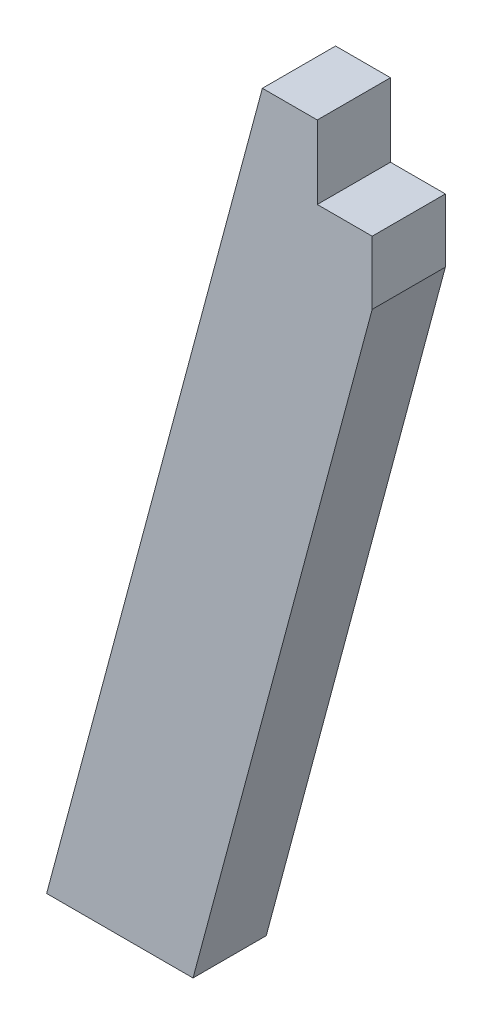
ISO-10303-21;
HEADER;
FILE_DESCRIPTION(('STEP AP214'),'2;1');
FILE_NAME('part.step','',(''),(''),'','','');
FILE_SCHEMA(('AUTOMOTIVE_DESIGN { 1 0 10303 214 1 1 1 1 }'));
ENDSEC;
DATA;
#1=APPLICATION_CONTEXT('core data for automotive mechanical design processes');
#2=APPLICATION_PROTOCOL_DEFINITION('international standard','automotive_design',2000,#1);
#3=PRODUCT_CONTEXT('',#1,'mechanical');
#4=PRODUCT('Part','Part','',(#3));
#5=PRODUCT_RELATED_PRODUCT_CATEGORY('part','',(#4));
#6=PRODUCT_DEFINITION_FORMATION('','',#4);
#7=PRODUCT_DEFINITION_CONTEXT('part definition',#1,'design');
#8=PRODUCT_DEFINITION('design','',#6,#7);
#9=PRODUCT_DEFINITION_SHAPE('','',#8);
#10=(LENGTH_UNIT() NAMED_UNIT(*) SI_UNIT(.MILLI.,.METRE.));
#11=(NAMED_UNIT(*) PLANE_ANGLE_UNIT() SI_UNIT($,.RADIAN.));
#12=(NAMED_UNIT(*) SI_UNIT($,.STERADIAN.) SOLID_ANGLE_UNIT());
#13=UNCERTAINTY_MEASURE_WITH_UNIT(LENGTH_MEASURE(1.E-05),#10,'distance_accuracy_value','');
#14=(GEOMETRIC_REPRESENTATION_CONTEXT(3) GLOBAL_UNCERTAINTY_ASSIGNED_CONTEXT((#13)) GLOBAL_UNIT_ASSIGNED_CONTEXT((#10,
#11,#12)) REPRESENTATION_CONTEXT('',''));
#15=CARTESIAN_POINT('',(0.,0.,0.));
#16=DIRECTION('',(0.,0.,1.));
#17=DIRECTION('',(1.,0.,0.));
#18=AXIS2_PLACEMENT_3D('',#15,#16,#17);
#19=CARTESIAN_POINT('',(124.330008730514,464.005909487753,50.8));
#20=DIRECTION('',(-0.965925826289067,0.258819045102525,0.));
#21=DIRECTION('',(-0.258819045102525,-0.965925826289067,0.));
#22=AXIS2_PLACEMENT_3D('',#19,#20,#21);
#23=PLANE('',#22);
#24=DIRECTION('',(0.258819045102525,0.965925826289067,0.));
#25=VECTOR('',#24,1.);
#26=CARTESIAN_POINT('',(124.330008730514,464.005909487753,0.));
#27=LINE('',#26,#25);
#28=CARTESIAN_POINT('',(0.,0.,0.));
#29=VERTEX_POINT('',#28);
#30=CARTESIAN_POINT('',(124.330008730514,464.005909487753,0.));
#31=VERTEX_POINT('',#30);
#32=EDGE_CURVE('E78',#29,#31,#27,.T.);
#33=ORIENTED_EDGE('',*,*,#32,.T.);
#34=DIRECTION('',(0.,0.,-1.));
#35=VECTOR('',#34,1.);
#36=CARTESIAN_POINT('',(124.330008730514,464.005909487753,50.8));
#37=LINE('',#36,#35);
#38=CARTESIAN_POINT('',(124.330008730514,464.005909487753,50.8));
#39=VERTEX_POINT('',#38);
#40=EDGE_CURVE('E11',#39,#31,#37,.T.);
#41=ORIENTED_EDGE('',*,*,#40,.F.);
#42=DIRECTION('',(0.258819045102525,0.965925826289067,0.));
#43=VECTOR('',#42,1.);
#44=CARTESIAN_POINT('',(124.330008730514,464.005909487753,50.8));
#45=LINE('',#44,#43);
#46=CARTESIAN_POINT('',(0.,0.,50.8));
#47=VERTEX_POINT('',#46);
#48=EDGE_CURVE('E103',#47,#39,#45,.T.);
#49=ORIENTED_EDGE('',*,*,#48,.F.);
#50=DIRECTION('',(0.,0.,-1.));
#51=VECTOR('',#50,1.);
#52=CARTESIAN_POINT('',(0.,0.,50.8));
#53=LINE('',#52,#51);
#54=EDGE_CURVE('E91',#47,#29,#53,.T.);
#55=ORIENTED_EDGE('',*,*,#54,.T.);
#56=EDGE_LOOP('',(#33,#41,#49,#55));
#57=FACE_BOUND('',#56,.T.);
#58=ADVANCED_FACE('F16',(#57),#23,.F.);
#59=CARTESIAN_POINT('',(124.330008730514,464.005909487753,50.8));
#60=DIRECTION('',(-1.,0.,0.));
#61=DIRECTION('',(0.,0.,1.));
#62=AXIS2_PLACEMENT_3D('',#59,#60,#61);
#63=PLANE('',#62);
#64=DIRECTION('',(0.,1.,0.));
#65=VECTOR('',#64,1.);
#66=CARTESIAN_POINT('',(124.330008730514,464.005909487753,0.));
#67=LINE('',#66,#65);
#68=CARTESIAN_POINT('',(124.330008730514,508.,0.));
#69=VERTEX_POINT('',#68);
#70=EDGE_CURVE('E74',#31,#69,#67,.T.);
#71=ORIENTED_EDGE('',*,*,#70,.T.);
#72=DIRECTION('',(0.,0.,-1.));
#73=VECTOR('',#72,1.);
#74=CARTESIAN_POINT('',(124.330008730514,508.,50.8));
#75=LINE('',#74,#73);
#76=CARTESIAN_POINT('',(124.330008730514,508.,50.8));
#77=VERTEX_POINT('',#76);
#78=EDGE_CURVE('E23',#77,#69,#75,.T.);
#79=ORIENTED_EDGE('',*,*,#78,.F.);
#80=DIRECTION('',(0.,1.,0.));
#81=VECTOR('',#80,1.);
#82=CARTESIAN_POINT('',(124.330008730514,464.005909487753,50.8));
#83=LINE('',#82,#81);
#84=EDGE_CURVE('E87',#39,#77,#83,.T.);
#85=ORIENTED_EDGE('',*,*,#84,.F.);
#86=ORIENTED_EDGE('',*,*,#40,.T.);
#87=EDGE_LOOP('',(#71,#79,#85,#86));
#88=FACE_BOUND('',#87,.T.);
#89=ADVANCED_FACE('F86',(#88),#63,.F.);
#90=CARTESIAN_POINT('',(86.2300087305138,508.,50.8));
#91=DIRECTION('',(0.,-1.,0.));
#92=DIRECTION('',(1.,0.,0.));
#93=AXIS2_PLACEMENT_3D('',#90,#91,#92);
#94=PLANE('',#93);
#95=DIRECTION('',(-1.,0.,0.));
#96=VECTOR('',#95,1.);
#97=CARTESIAN_POINT('',(86.2300087305138,508.,0.));
#98=LINE('',#97,#96);
#99=CARTESIAN_POINT('',(86.2300087305138,508.,0.));
#100=VERTEX_POINT('',#99);
#101=EDGE_CURVE('E80',#69,#100,#98,.T.);
#102=ORIENTED_EDGE('',*,*,#101,.T.);
#103=DIRECTION('',(0.,0.,-1.));
#104=VECTOR('',#103,1.);
#105=CARTESIAN_POINT('',(86.2300087305138,508.,50.8));
#106=LINE('',#105,#104);
#107=CARTESIAN_POINT('',(86.2300087305138,508.,50.8));
#108=VERTEX_POINT('',#107);
#109=EDGE_CURVE('E124',#108,#100,#106,.T.);
#110=ORIENTED_EDGE('',*,*,#109,.F.);
#111=DIRECTION('',(-1.,0.,0.));
#112=VECTOR('',#111,1.);
#113=CARTESIAN_POINT('',(86.2300087305138,508.,50.8));
#114=LINE('',#113,#112);
#115=EDGE_CURVE('E106',#77,#108,#114,.T.);
#116=ORIENTED_EDGE('',*,*,#115,.F.);
#117=ORIENTED_EDGE('',*,*,#78,.T.);
#118=EDGE_LOOP('',(#102,#110,#116,#117));
#119=FACE_BOUND('',#118,.T.);
#120=ADVANCED_FACE('F128',(#119),#94,.F.);
#121=CARTESIAN_POINT('',(86.2300087305138,558.8,50.8));
#122=DIRECTION('',(-1.,0.,0.));
#123=DIRECTION('',(0.,0.,1.));
#124=AXIS2_PLACEMENT_3D('',#121,#122,#123);
#125=PLANE('',#124);
#126=DIRECTION('',(0.,1.,0.));
#127=VECTOR('',#126,1.);
#128=CARTESIAN_POINT('',(86.2300087305138,558.8,0.));
#129=LINE('',#128,#127);
#130=CARTESIAN_POINT('',(86.2300087305138,558.8,0.));
#131=VERTEX_POINT('',#130);
#132=EDGE_CURVE('E95',#100,#131,#129,.T.);
#133=ORIENTED_EDGE('',*,*,#132,.T.);
#134=DIRECTION('',(0.,0.,-1.));
#135=VECTOR('',#134,1.);
#136=CARTESIAN_POINT('',(86.2300087305138,558.8,50.8));
#137=LINE('',#136,#135);
#138=CARTESIAN_POINT('',(86.2300087305138,558.8,50.8));
#139=VERTEX_POINT('',#138);
#140=EDGE_CURVE('E121',#139,#131,#137,.T.);
#141=ORIENTED_EDGE('',*,*,#140,.F.);
#142=DIRECTION('',(0.,1.,0.));
#143=VECTOR('',#142,1.);
#144=CARTESIAN_POINT('',(86.2300087305138,558.8,50.8));
#145=LINE('',#144,#143);
#146=EDGE_CURVE('E108',#108,#139,#145,.T.);
#147=ORIENTED_EDGE('',*,*,#146,.F.);
#148=ORIENTED_EDGE('',*,*,#109,.T.);
#149=EDGE_LOOP('',(#133,#141,#147,#148));
#150=FACE_BOUND('',#149,.T.);
#151=ADVANCED_FACE('F136',(#150),#125,.F.);
#152=CARTESIAN_POINT('',(48.1300087305138,558.8,50.8));
#153=DIRECTION('',(0.,-1.,0.));
#154=DIRECTION('',(1.,0.,0.));
#155=AXIS2_PLACEMENT_3D('',#152,#153,#154);
#156=PLANE('',#155);
#157=DIRECTION('',(-1.,0.,0.));
#158=VECTOR('',#157,1.);
#159=CARTESIAN_POINT('',(48.1300087305138,558.8,0.));
#160=LINE('',#159,#158);
#161=CARTESIAN_POINT('',(48.1300087305138,558.8,0.));
#162=VERTEX_POINT('',#161);
#163=EDGE_CURVE('E97',#131,#162,#160,.T.);
#164=ORIENTED_EDGE('',*,*,#163,.T.);
#165=DIRECTION('',(0.,0.,-1.));
#166=VECTOR('',#165,1.);
#167=CARTESIAN_POINT('',(48.1300087305138,558.8,50.8));
#168=LINE('',#167,#166);
#169=CARTESIAN_POINT('',(48.1300087305138,558.8,50.8));
#170=VERTEX_POINT('',#169);
#171=EDGE_CURVE('E118',#170,#162,#168,.T.);
#172=ORIENTED_EDGE('',*,*,#171,.F.);
#173=DIRECTION('',(-1.,0.,0.));
#174=VECTOR('',#173,1.);
#175=CARTESIAN_POINT('',(48.1300087305138,558.8,50.8));
#176=LINE('',#175,#174);
#177=EDGE_CURVE('E110',#139,#170,#176,.T.);
#178=ORIENTED_EDGE('',*,*,#177,.F.);
#179=ORIENTED_EDGE('',*,*,#140,.T.);
#180=EDGE_LOOP('',(#164,#172,#178,#179));
#181=FACE_BOUND('',#180,.T.);
#182=ADVANCED_FACE('F139',(#181),#156,.F.);
#183=CARTESIAN_POINT('',(-101.6,0.,50.8));
#184=DIRECTION('',(0.965925826289067,-0.258819045102525,0.));
#185=DIRECTION('',(0.258819045102525,0.965925826289067,0.));
#186=AXIS2_PLACEMENT_3D('',#183,#184,#185);
#187=PLANE('',#186);
#188=DIRECTION('',(-0.258819045102525,-0.965925826289067,0.));
#189=VECTOR('',#188,1.);
#190=CARTESIAN_POINT('',(-101.6,0.,0.));
#191=LINE('',#190,#189);
#192=CARTESIAN_POINT('',(-101.6,0.,0.));
#193=VERTEX_POINT('',#192);
#194=EDGE_CURVE('E99',#162,#193,#191,.T.);
#195=ORIENTED_EDGE('',*,*,#194,.T.);
#196=DIRECTION('',(0.,0.,-1.));
#197=VECTOR('',#196,1.);
#198=CARTESIAN_POINT('',(-101.6,0.,50.8));
#199=LINE('',#198,#197);
#200=CARTESIAN_POINT('',(-101.6,0.,50.8));
#201=VERTEX_POINT('',#200);
#202=EDGE_CURVE('E115',#201,#193,#199,.T.);
#203=ORIENTED_EDGE('',*,*,#202,.F.);
#204=DIRECTION('',(-0.258819045102525,-0.965925826289067,0.));
#205=VECTOR('',#204,1.);
#206=CARTESIAN_POINT('',(-101.6,0.,50.8));
#207=LINE('',#206,#205);
#208=EDGE_CURVE('E35',#170,#201,#207,.T.);
#209=ORIENTED_EDGE('',*,*,#208,.F.);
#210=ORIENTED_EDGE('',*,*,#171,.T.);
#211=EDGE_LOOP('',(#195,#203,#209,#210));
#212=FACE_BOUND('',#211,.T.);
#213=ADVANCED_FACE('F142',(#212),#187,.F.);
#214=CARTESIAN_POINT('',(0.,0.,50.8));
#215=DIRECTION('',(0.,1.,0.));
#216=DIRECTION('',(-1.,0.,0.));
#217=AXIS2_PLACEMENT_3D('',#214,#215,#216);
#218=PLANE('',#217);
#219=DIRECTION('',(1.,0.,0.));
#220=VECTOR('',#219,1.);
#221=CARTESIAN_POINT('',(0.,0.,0.));
#222=LINE('',#221,#220);
#223=EDGE_CURVE('E101',#193,#29,#222,.T.);
#224=ORIENTED_EDGE('',*,*,#223,.T.);
#225=ORIENTED_EDGE('',*,*,#54,.F.);
#226=DIRECTION('',(1.,0.,0.));
#227=VECTOR('',#226,1.);
#228=CARTESIAN_POINT('',(0.,0.,50.8));
#229=LINE('',#228,#227);
#230=EDGE_CURVE('E30',#201,#47,#229,.T.);
#231=ORIENTED_EDGE('',*,*,#230,.F.);
#232=ORIENTED_EDGE('',*,*,#202,.T.);
#233=EDGE_LOOP('',(#224,#225,#231,#232));
#234=FACE_BOUND('',#233,.T.);
#235=ADVANCED_FACE('F144',(#234),#218,.F.);
#236=CARTESIAN_POINT('',(136.118189755012,508.,50.8));
#237=DIRECTION('',(0.,0.,1.));
#238=DIRECTION('',(1.,0.,0.));
#239=AXIS2_PLACEMENT_3D('',#236,#237,#238);
#240=PLANE('',#239);
#241=ORIENTED_EDGE('',*,*,#48,.T.);
#242=ORIENTED_EDGE('',*,*,#84,.T.);
#243=ORIENTED_EDGE('',*,*,#115,.T.);
#244=ORIENTED_EDGE('',*,*,#146,.T.);
#245=ORIENTED_EDGE('',*,*,#177,.T.);
#246=ORIENTED_EDGE('',*,*,#208,.T.);
#247=ORIENTED_EDGE('',*,*,#230,.T.);
#248=EDGE_LOOP('',(#241,#242,#243,#244,#245,#246,#247));
#249=FACE_BOUND('',#248,.T.);
#250=ADVANCED_FACE('F131',(#249),#240,.T.);
#251=CARTESIAN_POINT('',(136.118189755012,508.,0.));
#252=DIRECTION('',(0.,0.,1.));
#253=DIRECTION('',(1.,0.,0.));
#254=AXIS2_PLACEMENT_3D('',#251,#252,#253);
#255=PLANE('',#254);
#256=ORIENTED_EDGE('',*,*,#32,.F.);
#257=ORIENTED_EDGE('',*,*,#223,.F.);
#258=ORIENTED_EDGE('',*,*,#194,.F.);
#259=ORIENTED_EDGE('',*,*,#163,.F.);
#260=ORIENTED_EDGE('',*,*,#132,.F.);
#261=ORIENTED_EDGE('',*,*,#101,.F.);
#262=ORIENTED_EDGE('',*,*,#70,.F.);
#263=EDGE_LOOP('',(#256,#257,#258,#259,#260,#261,#262));
#264=FACE_BOUND('',#263,.T.);
#265=ADVANCED_FACE('F75',(#264),#255,.F.);
#266=CLOSED_SHELL('',(#58,#89,#120,#151,#182,#213,#235,#250,#265));
#267=MANIFOLD_SOLID_BREP('B1',#266);
#268=ADVANCED_BREP_SHAPE_REPRESENTATION('',(#18,#267),#14);
#269=SHAPE_DEFINITION_REPRESENTATION(#9,#268);
ENDSEC;
END-ISO-10303-21;
